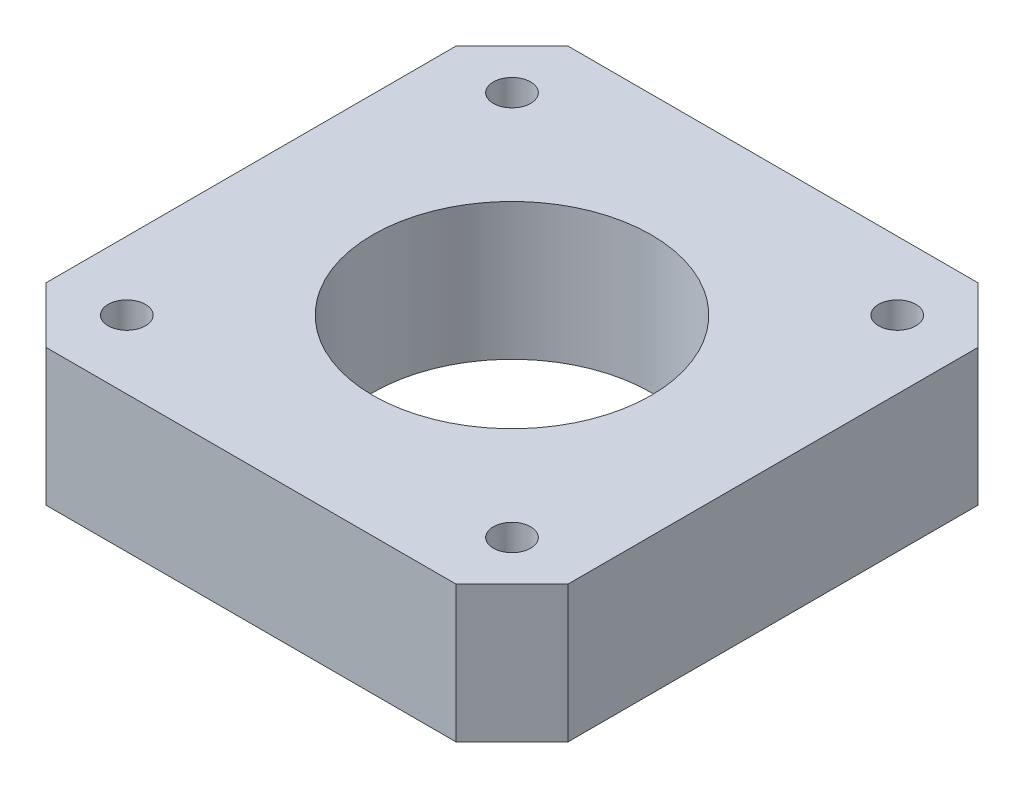
ISO-10303-21;
HEADER;
FILE_DESCRIPTION(('STEP AP214'),'2;1');
FILE_NAME('part.step','',(''),(''),'','','');
FILE_SCHEMA(('AUTOMOTIVE_DESIGN { 1 0 10303 214 1 1 1 1 }'));
ENDSEC;
DATA;
#1=APPLICATION_CONTEXT('core data for automotive mechanical design processes');
#2=APPLICATION_PROTOCOL_DEFINITION('international standard','automotive_design',2000,#1);
#3=PRODUCT_CONTEXT('',#1,'mechanical');
#4=PRODUCT('Part','Part','',(#3));
#5=PRODUCT_RELATED_PRODUCT_CATEGORY('part','',(#4));
#6=PRODUCT_DEFINITION_FORMATION('','',#4);
#7=PRODUCT_DEFINITION_CONTEXT('part definition',#1,'design');
#8=PRODUCT_DEFINITION('design','',#6,#7);
#9=PRODUCT_DEFINITION_SHAPE('','',#8);
#10=(LENGTH_UNIT() NAMED_UNIT(*) SI_UNIT(.MILLI.,.METRE.));
#11=(NAMED_UNIT(*) PLANE_ANGLE_UNIT() SI_UNIT($,.RADIAN.));
#12=(NAMED_UNIT(*) SI_UNIT($,.STERADIAN.) SOLID_ANGLE_UNIT());
#13=UNCERTAINTY_MEASURE_WITH_UNIT(LENGTH_MEASURE(1.E-05),#10,'distance_accuracy_value','');
#14=(GEOMETRIC_REPRESENTATION_CONTEXT(3) GLOBAL_UNCERTAINTY_ASSIGNED_CONTEXT((#13)) GLOBAL_UNIT_ASSIGNED_CONTEXT((#10,
#11,#12)) REPRESENTATION_CONTEXT('',''));
#15=CARTESIAN_POINT('',(0.,0.,0.));
#16=DIRECTION('',(0.,0.,1.));
#17=DIRECTION('',(1.,0.,0.));
#18=AXIS2_PLACEMENT_3D('',#15,#16,#17);
#19=CARTESIAN_POINT('',(21.,11.,21.));
#20=DIRECTION('',(-1.,0.,0.));
#21=DIRECTION('',(0.,0.,1.));
#22=AXIS2_PLACEMENT_3D('',#19,#20,#21);
#23=PLANE('',#22);
#24=DIRECTION('',(0.,0.,-1.));
#25=VECTOR('',#24,1.);
#26=CARTESIAN_POINT('',(21.,0.,21.));
#27=LINE('',#26,#25);
#28=CARTESIAN_POINT('',(21.,0.,16.5));
#29=VERTEX_POINT('',#28);
#30=CARTESIAN_POINT('',(21.,0.,-16.5));
#31=VERTEX_POINT('',#30);
#32=EDGE_CURVE('E132',#29,#31,#27,.T.);
#33=ORIENTED_EDGE('',*,*,#32,.T.);
#34=DIRECTION('',(0.,1.,0.));
#35=VECTOR('',#34,1.);
#36=CARTESIAN_POINT('',(21.,11.,-16.5));
#37=LINE('',#36,#35);
#38=CARTESIAN_POINT('',(21.,11.,-16.5));
#39=VERTEX_POINT('',#38);
#40=EDGE_CURVE('E155',#31,#39,#37,.T.);
#41=ORIENTED_EDGE('',*,*,#40,.T.);
#42=DIRECTION('',(0.,0.,-1.));
#43=VECTOR('',#42,1.);
#44=CARTESIAN_POINT('',(21.,11.,21.));
#45=LINE('',#44,#43);
#46=CARTESIAN_POINT('',(21.,11.,16.5));
#47=VERTEX_POINT('',#46);
#48=EDGE_CURVE('E130',#47,#39,#45,.T.);
#49=ORIENTED_EDGE('',*,*,#48,.F.);
#50=DIRECTION('',(0.,-1.,0.));
#51=VECTOR('',#50,1.);
#52=CARTESIAN_POINT('',(21.,11.,16.5));
#53=LINE('',#52,#51);
#54=EDGE_CURVE('E152',#47,#29,#53,.T.);
#55=ORIENTED_EDGE('',*,*,#54,.T.);
#56=EDGE_LOOP('',(#33,#41,#49,#55));
#57=FACE_BOUND('',#56,.T.);
#58=ADVANCED_FACE('F36',(#57),#23,.F.);
#59=CARTESIAN_POINT('',(-21.,11.,-21.));
#60=DIRECTION('',(0.,0.,1.));
#61=DIRECTION('',(1.,0.,0.));
#62=AXIS2_PLACEMENT_3D('',#59,#60,#61);
#63=PLANE('',#62);
#64=DIRECTION('',(-1.,0.,0.));
#65=VECTOR('',#64,1.);
#66=CARTESIAN_POINT('',(-21.,0.,-21.));
#67=LINE('',#66,#65);
#68=CARTESIAN_POINT('',(16.5,0.,-21.));
#69=VERTEX_POINT('',#68);
#70=CARTESIAN_POINT('',(-16.5,0.,-21.));
#71=VERTEX_POINT('',#70);
#72=EDGE_CURVE('E128',#69,#71,#67,.T.);
#73=ORIENTED_EDGE('',*,*,#72,.T.);
#74=DIRECTION('',(0.,1.,0.));
#75=VECTOR('',#74,1.);
#76=CARTESIAN_POINT('',(-16.5,11.,-21.));
#77=LINE('',#76,#75);
#78=CARTESIAN_POINT('',(-16.5,11.,-21.));
#79=VERTEX_POINT('',#78);
#80=EDGE_CURVE('E107',#71,#79,#77,.T.);
#81=ORIENTED_EDGE('',*,*,#80,.T.);
#82=DIRECTION('',(-1.,0.,0.));
#83=VECTOR('',#82,1.);
#84=CARTESIAN_POINT('',(-21.,11.,-21.));
#85=LINE('',#84,#83);
#86=CARTESIAN_POINT('',(16.5,11.,-21.));
#87=VERTEX_POINT('',#86);
#88=EDGE_CURVE('E171',#87,#79,#85,.T.);
#89=ORIENTED_EDGE('',*,*,#88,.F.);
#90=DIRECTION('',(0.,-1.,0.));
#91=VECTOR('',#90,1.);
#92=CARTESIAN_POINT('',(16.5,11.,-21.));
#93=LINE('',#92,#91);
#94=EDGE_CURVE('E112',#87,#69,#93,.T.);
#95=ORIENTED_EDGE('',*,*,#94,.T.);
#96=EDGE_LOOP('',(#73,#81,#89,#95));
#97=FACE_BOUND('',#96,.T.);
#98=ADVANCED_FACE('F226',(#97),#63,.F.);
#99=CARTESIAN_POINT('',(-21.,11.,21.));
#100=DIRECTION('',(1.,0.,0.));
#101=DIRECTION('',(0.,0.,-1.));
#102=AXIS2_PLACEMENT_3D('',#99,#100,#101);
#103=PLANE('',#102);
#104=DIRECTION('',(0.,0.,1.));
#105=VECTOR('',#104,1.);
#106=CARTESIAN_POINT('',(-21.,11.,21.));
#107=LINE('',#106,#105);
#108=CARTESIAN_POINT('',(-21.,11.,-16.5));
#109=VERTEX_POINT('',#108);
#110=CARTESIAN_POINT('',(-21.,11.,16.5));
#111=VERTEX_POINT('',#110);
#112=EDGE_CURVE('E121',#109,#111,#107,.T.);
#113=ORIENTED_EDGE('',*,*,#112,.F.);
#114=DIRECTION('',(0.,-1.,0.));
#115=VECTOR('',#114,1.);
#116=CARTESIAN_POINT('',(-21.,11.,-16.5));
#117=LINE('',#116,#115);
#118=CARTESIAN_POINT('',(-21.,0.,-16.5));
#119=VERTEX_POINT('',#118);
#120=EDGE_CURVE('E106',#109,#119,#117,.T.);
#121=ORIENTED_EDGE('',*,*,#120,.T.);
#122=DIRECTION('',(0.,0.,1.));
#123=VECTOR('',#122,1.);
#124=CARTESIAN_POINT('',(-21.,0.,21.));
#125=LINE('',#124,#123);
#126=CARTESIAN_POINT('',(-21.,0.,16.5));
#127=VERTEX_POINT('',#126);
#128=EDGE_CURVE('E119',#119,#127,#125,.T.);
#129=ORIENTED_EDGE('',*,*,#128,.T.);
#130=DIRECTION('',(0.,1.,0.));
#131=VECTOR('',#130,1.);
#132=CARTESIAN_POINT('',(-21.,11.,16.5));
#133=LINE('',#132,#131);
#134=EDGE_CURVE('E123',#127,#111,#133,.T.);
#135=ORIENTED_EDGE('',*,*,#134,.T.);
#136=EDGE_LOOP('',(#113,#121,#129,#135));
#137=FACE_BOUND('',#136,.T.);
#138=ADVANCED_FACE('F118',(#137),#103,.F.);
#139=CARTESIAN_POINT('',(-21.,11.,21.));
#140=DIRECTION('',(0.,0.,-1.));
#141=DIRECTION('',(-1.,0.,0.));
#142=AXIS2_PLACEMENT_3D('',#139,#140,#141);
#143=PLANE('',#142);
#144=DIRECTION('',(1.,0.,0.));
#145=VECTOR('',#144,1.);
#146=CARTESIAN_POINT('',(-21.,0.,21.));
#147=LINE('',#146,#145);
#148=CARTESIAN_POINT('',(-16.5,0.,21.));
#149=VERTEX_POINT('',#148);
#150=CARTESIAN_POINT('',(16.5,0.,21.));
#151=VERTEX_POINT('',#150);
#152=EDGE_CURVE('E127',#149,#151,#147,.T.);
#153=ORIENTED_EDGE('',*,*,#152,.T.);
#154=DIRECTION('',(0.,1.,0.));
#155=VECTOR('',#154,1.);
#156=CARTESIAN_POINT('',(16.5,11.,21.));
#157=LINE('',#156,#155);
#158=CARTESIAN_POINT('',(16.5,11.,21.));
#159=VERTEX_POINT('',#158);
#160=EDGE_CURVE('E11',#151,#159,#157,.T.);
#161=ORIENTED_EDGE('',*,*,#160,.T.);
#162=DIRECTION('',(1.,0.,0.));
#163=VECTOR('',#162,1.);
#164=CARTESIAN_POINT('',(-21.,11.,21.));
#165=LINE('',#164,#163);
#166=CARTESIAN_POINT('',(-16.5,11.,21.));
#167=VERTEX_POINT('',#166);
#168=EDGE_CURVE('E136',#167,#159,#165,.T.);
#169=ORIENTED_EDGE('',*,*,#168,.F.);
#170=DIRECTION('',(0.,-1.,0.));
#171=VECTOR('',#170,1.);
#172=CARTESIAN_POINT('',(-16.5,11.,21.));
#173=LINE('',#172,#171);
#174=EDGE_CURVE('E45',#167,#149,#173,.T.);
#175=ORIENTED_EDGE('',*,*,#174,.T.);
#176=EDGE_LOOP('',(#153,#161,#169,#175));
#177=FACE_BOUND('',#176,.T.);
#178=ADVANCED_FACE('F158',(#177),#143,.F.);
#179=CARTESIAN_POINT('',(0.,11.,0.));
#180=DIRECTION('',(0.,-1.,0.));
#181=DIRECTION('',(0.,0.,-1.));
#182=AXIS2_PLACEMENT_3D('',#179,#180,#181);
#183=PLANE('',#182);
#184=CARTESIAN_POINT('',(0.,11.,0.));
#185=DIRECTION('',(0.,1.,0.));
#186=DIRECTION('',(0.,0.,1.));
#187=AXIS2_PLACEMENT_3D('',#184,#185,#186);
#188=CIRCLE('',#187,11.2);
#189=CARTESIAN_POINT('',(0.,11.,11.2));
#190=VERTEX_POINT('',#189);
#191=EDGE_CURVE('E191',#190,#190,#188,.T.);
#192=ORIENTED_EDGE('',*,*,#191,.F.);
#193=EDGE_LOOP('',(#192));
#194=FACE_BOUND('',#193,.T.);
#195=CARTESIAN_POINT('',(-15.4999999999991,11.,15.5));
#196=DIRECTION('',(0.,1.,0.));
#197=DIRECTION('',(0.,0.,1.));
#198=AXIS2_PLACEMENT_3D('',#195,#196,#197);
#199=CIRCLE('',#198,1.50000000000046);
#200=CARTESIAN_POINT('',(-15.4999999999991,11.,17.0000000000005));
#201=VERTEX_POINT('',#200);
#202=EDGE_CURVE('E190',#201,#201,#199,.T.);
#203=ORIENTED_EDGE('',*,*,#202,.F.);
#204=EDGE_LOOP('',(#203));
#205=FACE_BOUND('',#204,.T.);
#206=CARTESIAN_POINT('',(15.5000000000009,11.,15.4999999999991));
#207=DIRECTION('',(0.,1.,0.));
#208=DIRECTION('',(0.,0.,1.));
#209=AXIS2_PLACEMENT_3D('',#206,#207,#208);
#210=CIRCLE('',#209,1.50000000000122);
#211=CARTESIAN_POINT('',(15.5000000000009,11.,17.0000000000003));
#212=VERTEX_POINT('',#211);
#213=EDGE_CURVE('E197',#212,#212,#210,.T.);
#214=ORIENTED_EDGE('',*,*,#213,.F.);
#215=EDGE_LOOP('',(#214));
#216=FACE_BOUND('',#215,.T.);
#217=CARTESIAN_POINT('',(15.5,11.,-15.5000000000009));
#218=DIRECTION('',(0.,1.,0.));
#219=DIRECTION('',(0.,0.,1.));
#220=AXIS2_PLACEMENT_3D('',#217,#218,#219);
#221=CIRCLE('',#220,1.5000000000009);
#222=CARTESIAN_POINT('',(15.5,11.,-14.));
#223=VERTEX_POINT('',#222);
#224=EDGE_CURVE('E185',#223,#223,#221,.T.);
#225=ORIENTED_EDGE('',*,*,#224,.F.);
#226=EDGE_LOOP('',(#225));
#227=FACE_BOUND('',#226,.T.);
#228=CARTESIAN_POINT('',(-15.5,11.,-15.5));
#229=DIRECTION('',(0.,1.,0.));
#230=DIRECTION('',(0.,0.,1.));
#231=AXIS2_PLACEMENT_3D('',#228,#229,#230);
#232=CIRCLE('',#231,1.5);
#233=CARTESIAN_POINT('',(-15.5,11.,-14.));
#234=VERTEX_POINT('',#233);
#235=EDGE_CURVE('E180',#234,#234,#232,.T.);
#236=ORIENTED_EDGE('',*,*,#235,.F.);
#237=EDGE_LOOP('',(#236));
#238=FACE_BOUND('',#237,.T.);
#239=ORIENTED_EDGE('',*,*,#88,.T.);
#240=DIRECTION('',(0.707106781186549,0.,-0.707106781186546));
#241=VECTOR('',#240,1.);
#242=CARTESIAN_POINT('',(-21.,11.,-16.5));
#243=LINE('',#242,#241);
#244=EDGE_CURVE('E150',#79,#109,#243,.F.);
#245=ORIENTED_EDGE('',*,*,#244,.T.);
#246=ORIENTED_EDGE('',*,*,#112,.T.);
#247=DIRECTION('',(-0.707106781186546,0.,-0.707106781186549));
#248=VECTOR('',#247,1.);
#249=CARTESIAN_POINT('',(-16.5,11.,21.));
#250=LINE('',#249,#248);
#251=EDGE_CURVE('E57',#111,#167,#250,.F.);
#252=ORIENTED_EDGE('',*,*,#251,.T.);
#253=ORIENTED_EDGE('',*,*,#168,.T.);
#254=DIRECTION('',(-0.707106781186549,0.,0.707106781186546));
#255=VECTOR('',#254,1.);
#256=CARTESIAN_POINT('',(21.,11.,16.5));
#257=LINE('',#256,#255);
#258=EDGE_CURVE('E146',#159,#47,#257,.F.);
#259=ORIENTED_EDGE('',*,*,#258,.T.);
#260=ORIENTED_EDGE('',*,*,#48,.T.);
#261=DIRECTION('',(0.707106781186546,0.,0.707106781186549));
#262=VECTOR('',#261,1.);
#263=CARTESIAN_POINT('',(16.5,11.,-21.));
#264=LINE('',#263,#262);
#265=EDGE_CURVE('E148',#39,#87,#264,.F.);
#266=ORIENTED_EDGE('',*,*,#265,.T.);
#267=EDGE_LOOP('',(#239,#245,#246,#252,#253,#259,#260,#266));
#268=FACE_BOUND('',#267,.T.);
#269=ADVANCED_FACE('F213',(#194,#205,#216,#227,#238,#268),#183,.F.);
#270=CARTESIAN_POINT('',(0.,0.,0.));
#271=DIRECTION('',(0.,-1.,0.));
#272=DIRECTION('',(0.,0.,-1.));
#273=AXIS2_PLACEMENT_3D('',#270,#271,#272);
#274=PLANE('',#273);
#275=CARTESIAN_POINT('',(0.,0.,0.));
#276=DIRECTION('',(0.,-1.,0.));
#277=DIRECTION('',(0.,0.,-1.));
#278=AXIS2_PLACEMENT_3D('',#275,#276,#277);
#279=CIRCLE('',#278,11.2);
#280=CARTESIAN_POINT('',(0.,0.,-11.2));
#281=VERTEX_POINT('',#280);
#282=EDGE_CURVE('E205',#281,#281,#279,.F.);
#283=ORIENTED_EDGE('',*,*,#282,.T.);
#284=EDGE_LOOP('',(#283));
#285=FACE_BOUND('',#284,.T.);
#286=CARTESIAN_POINT('',(-15.4999999999991,0.,15.5));
#287=DIRECTION('',(0.,-1.,0.));
#288=DIRECTION('',(0.,0.,-1.));
#289=AXIS2_PLACEMENT_3D('',#286,#287,#288);
#290=CIRCLE('',#289,1.50000000000046);
#291=CARTESIAN_POINT('',(-15.4999999999991,0.,13.9999999999995));
#292=VERTEX_POINT('',#291);
#293=EDGE_CURVE('E187',#292,#292,#290,.F.);
#294=ORIENTED_EDGE('',*,*,#293,.T.);
#295=EDGE_LOOP('',(#294));
#296=FACE_BOUND('',#295,.T.);
#297=CARTESIAN_POINT('',(15.5000000000009,0.,15.4999999999991));
#298=DIRECTION('',(0.,-1.,0.));
#299=DIRECTION('',(0.,0.,-1.));
#300=AXIS2_PLACEMENT_3D('',#297,#298,#299);
#301=CIRCLE('',#300,1.50000000000122);
#302=CARTESIAN_POINT('',(15.5000000000009,0.,13.9999999999979));
#303=VERTEX_POINT('',#302);
#304=EDGE_CURVE('E194',#303,#303,#301,.F.);
#305=ORIENTED_EDGE('',*,*,#304,.T.);
#306=EDGE_LOOP('',(#305));
#307=FACE_BOUND('',#306,.T.);
#308=CARTESIAN_POINT('',(15.5,0.,-15.5000000000009));
#309=DIRECTION('',(0.,-1.,0.));
#310=DIRECTION('',(0.,0.,-1.));
#311=AXIS2_PLACEMENT_3D('',#308,#309,#310);
#312=CIRCLE('',#311,1.5000000000009);
#313=CARTESIAN_POINT('',(15.5,0.,-17.0000000000018));
#314=VERTEX_POINT('',#313);
#315=EDGE_CURVE('E200',#314,#314,#312,.F.);
#316=ORIENTED_EDGE('',*,*,#315,.T.);
#317=EDGE_LOOP('',(#316));
#318=FACE_BOUND('',#317,.T.);
#319=CARTESIAN_POINT('',(-15.5,0.,-15.5));
#320=DIRECTION('',(0.,-1.,0.));
#321=DIRECTION('',(0.,0.,-1.));
#322=AXIS2_PLACEMENT_3D('',#319,#320,#321);
#323=CIRCLE('',#322,1.5);
#324=CARTESIAN_POINT('',(-15.5,0.,-17.));
#325=VERTEX_POINT('',#324);
#326=EDGE_CURVE('E176',#325,#325,#323,.F.);
#327=ORIENTED_EDGE('',*,*,#326,.T.);
#328=EDGE_LOOP('',(#327));
#329=FACE_BOUND('',#328,.T.);
#330=ORIENTED_EDGE('',*,*,#128,.F.);
#331=DIRECTION('',(-0.707106781186549,0.,0.707106781186546));
#332=VECTOR('',#331,1.);
#333=CARTESIAN_POINT('',(-18.75,0.,-18.75));
#334=LINE('',#333,#332);
#335=EDGE_CURVE('E102',#119,#71,#334,.F.);
#336=ORIENTED_EDGE('',*,*,#335,.T.);
#337=ORIENTED_EDGE('',*,*,#72,.F.);
#338=DIRECTION('',(-0.707106781186546,0.,-0.707106781186549));
#339=VECTOR('',#338,1.);
#340=CARTESIAN_POINT('',(18.75,0.,-18.75));
#341=LINE('',#340,#339);
#342=EDGE_CURVE('E113',#69,#31,#341,.F.);
#343=ORIENTED_EDGE('',*,*,#342,.T.);
#344=ORIENTED_EDGE('',*,*,#32,.F.);
#345=DIRECTION('',(0.707106781186549,0.,-0.707106781186546));
#346=VECTOR('',#345,1.);
#347=CARTESIAN_POINT('',(18.7499999999999,0.,18.75));
#348=LINE('',#347,#346);
#349=EDGE_CURVE('E139',#29,#151,#348,.F.);
#350=ORIENTED_EDGE('',*,*,#349,.T.);
#351=ORIENTED_EDGE('',*,*,#152,.F.);
#352=DIRECTION('',(0.707106781186546,0.,0.707106781186549));
#353=VECTOR('',#352,1.);
#354=CARTESIAN_POINT('',(-18.75,0.,18.75));
#355=LINE('',#354,#353);
#356=EDGE_CURVE('E122',#149,#127,#355,.F.);
#357=ORIENTED_EDGE('',*,*,#356,.T.);
#358=EDGE_LOOP('',(#330,#336,#337,#343,#344,#350,#351,#357));
#359=FACE_BOUND('',#358,.T.);
#360=ADVANCED_FACE('F125',(#285,#296,#307,#318,#329,#359),#274,.T.);
#361=CARTESIAN_POINT('',(-21.,11.,-16.5));
#362=DIRECTION('',(0.707106781186546,0.,0.707106781186549));
#363=DIRECTION('',(0.,-1.,0.));
#364=AXIS2_PLACEMENT_3D('',#361,#362,#363);
#365=PLANE('',#364);
#366=ORIENTED_EDGE('',*,*,#244,.F.);
#367=ORIENTED_EDGE('',*,*,#80,.F.);
#368=ORIENTED_EDGE('',*,*,#335,.F.);
#369=ORIENTED_EDGE('',*,*,#120,.F.);
#370=EDGE_LOOP('',(#366,#367,#368,#369));
#371=FACE_BOUND('',#370,.T.);
#372=ADVANCED_FACE('F105',(#371),#365,.F.);
#373=CARTESIAN_POINT('',(16.5,11.,-21.));
#374=DIRECTION('',(-0.707106781186549,0.,0.707106781186546));
#375=DIRECTION('',(0.,-1.,0.));
#376=AXIS2_PLACEMENT_3D('',#373,#374,#375);
#377=PLANE('',#376);
#378=ORIENTED_EDGE('',*,*,#265,.F.);
#379=ORIENTED_EDGE('',*,*,#40,.F.);
#380=ORIENTED_EDGE('',*,*,#342,.F.);
#381=ORIENTED_EDGE('',*,*,#94,.F.);
#382=EDGE_LOOP('',(#378,#379,#380,#381));
#383=FACE_BOUND('',#382,.T.);
#384=ADVANCED_FACE('F228',(#383),#377,.F.);
#385=CARTESIAN_POINT('',(21.,11.,16.5));
#386=DIRECTION('',(-0.707106781186545,0.,-0.707106781186549));
#387=DIRECTION('',(0.,-1.,0.));
#388=AXIS2_PLACEMENT_3D('',#385,#386,#387);
#389=PLANE('',#388);
#390=ORIENTED_EDGE('',*,*,#258,.F.);
#391=ORIENTED_EDGE('',*,*,#160,.F.);
#392=ORIENTED_EDGE('',*,*,#349,.F.);
#393=ORIENTED_EDGE('',*,*,#54,.F.);
#394=EDGE_LOOP('',(#390,#391,#392,#393));
#395=FACE_BOUND('',#394,.T.);
#396=ADVANCED_FACE('F165',(#395),#389,.F.);
#397=CARTESIAN_POINT('',(-16.5,11.,21.));
#398=DIRECTION('',(0.707106781186549,0.,-0.707106781186546));
#399=DIRECTION('',(0.,-1.,0.));
#400=AXIS2_PLACEMENT_3D('',#397,#398,#399);
#401=PLANE('',#400);
#402=ORIENTED_EDGE('',*,*,#251,.F.);
#403=ORIENTED_EDGE('',*,*,#134,.F.);
#404=ORIENTED_EDGE('',*,*,#356,.F.);
#405=ORIENTED_EDGE('',*,*,#174,.F.);
#406=EDGE_LOOP('',(#402,#403,#404,#405));
#407=FACE_BOUND('',#406,.T.);
#408=ADVANCED_FACE('F39',(#407),#401,.F.);
#409=CARTESIAN_POINT('',(-15.5,-0.000999999999999265,-15.5));
#410=DIRECTION('',(0.,1.,0.));
#411=DIRECTION('',(0.,0.,1.));
#412=AXIS2_PLACEMENT_3D('',#409,#410,#411);
#413=CYLINDRICAL_SURFACE('',#412,1.5);
#414=ORIENTED_EDGE('',*,*,#326,.F.);
#415=EDGE_LOOP('',(#414));
#416=FACE_BOUND('',#415,.T.);
#417=ORIENTED_EDGE('',*,*,#235,.T.);
#418=EDGE_LOOP('',(#417));
#419=FACE_BOUND('',#418,.T.);
#420=ADVANCED_FACE('F261',(#416,#419),#413,.F.);
#421=CARTESIAN_POINT('',(15.5,-0.000999999999999265,-15.5000000000009));
#422=DIRECTION('',(0.,1.,0.));
#423=DIRECTION('',(0.,0.,1.));
#424=AXIS2_PLACEMENT_3D('',#421,#422,#423);
#425=CYLINDRICAL_SURFACE('',#424,1.5000000000009);
#426=ORIENTED_EDGE('',*,*,#315,.F.);
#427=EDGE_LOOP('',(#426));
#428=FACE_BOUND('',#427,.T.);
#429=ORIENTED_EDGE('',*,*,#224,.T.);
#430=EDGE_LOOP('',(#429));
#431=FACE_BOUND('',#430,.T.);
#432=ADVANCED_FACE('F264',(#428,#431),#425,.F.);
#433=CARTESIAN_POINT('',(15.5000000000009,-0.000999999999999265,15.4999999999991));
#434=DIRECTION('',(0.,1.,0.));
#435=DIRECTION('',(0.,0.,1.));
#436=AXIS2_PLACEMENT_3D('',#433,#434,#435);
#437=CYLINDRICAL_SURFACE('',#436,1.50000000000122);
#438=ORIENTED_EDGE('',*,*,#304,.F.);
#439=EDGE_LOOP('',(#438));
#440=FACE_BOUND('',#439,.T.);
#441=ORIENTED_EDGE('',*,*,#213,.T.);
#442=EDGE_LOOP('',(#441));
#443=FACE_BOUND('',#442,.T.);
#444=ADVANCED_FACE('F269',(#440,#443),#437,.F.);
#445=CARTESIAN_POINT('',(-15.4999999999991,-0.000999999999999265,15.5));
#446=DIRECTION('',(0.,1.,0.));
#447=DIRECTION('',(0.,0.,1.));
#448=AXIS2_PLACEMENT_3D('',#445,#446,#447);
#449=CYLINDRICAL_SURFACE('',#448,1.50000000000046);
#450=ORIENTED_EDGE('',*,*,#293,.F.);
#451=EDGE_LOOP('',(#450));
#452=FACE_BOUND('',#451,.T.);
#453=ORIENTED_EDGE('',*,*,#202,.T.);
#454=EDGE_LOOP('',(#453));
#455=FACE_BOUND('',#454,.T.);
#456=ADVANCED_FACE('F266',(#452,#455),#449,.F.);
#457=CARTESIAN_POINT('',(0.,-0.000999999999999265,0.));
#458=DIRECTION('',(0.,1.,0.));
#459=DIRECTION('',(0.,0.,1.));
#460=AXIS2_PLACEMENT_3D('',#457,#458,#459);
#461=CYLINDRICAL_SURFACE('',#460,11.2);
#462=ORIENTED_EDGE('',*,*,#282,.F.);
#463=EDGE_LOOP('',(#462));
#464=FACE_BOUND('',#463,.T.);
#465=ORIENTED_EDGE('',*,*,#191,.T.);
#466=EDGE_LOOP('',(#465));
#467=FACE_BOUND('',#466,.T.);
#468=ADVANCED_FACE('F211',(#464,#467),#461,.F.);
#469=CLOSED_SHELL('',(#58,#98,#138,#178,#269,#360,#372,#384,#396,#408,#420,#432,#444,#456,#468));
#470=MANIFOLD_SOLID_BREP('B2',#469);
#471=ADVANCED_BREP_SHAPE_REPRESENTATION('',(#18,#470),#14);
#472=SHAPE_DEFINITION_REPRESENTATION(#9,#471);
ENDSEC;
END-ISO-10303-21;
